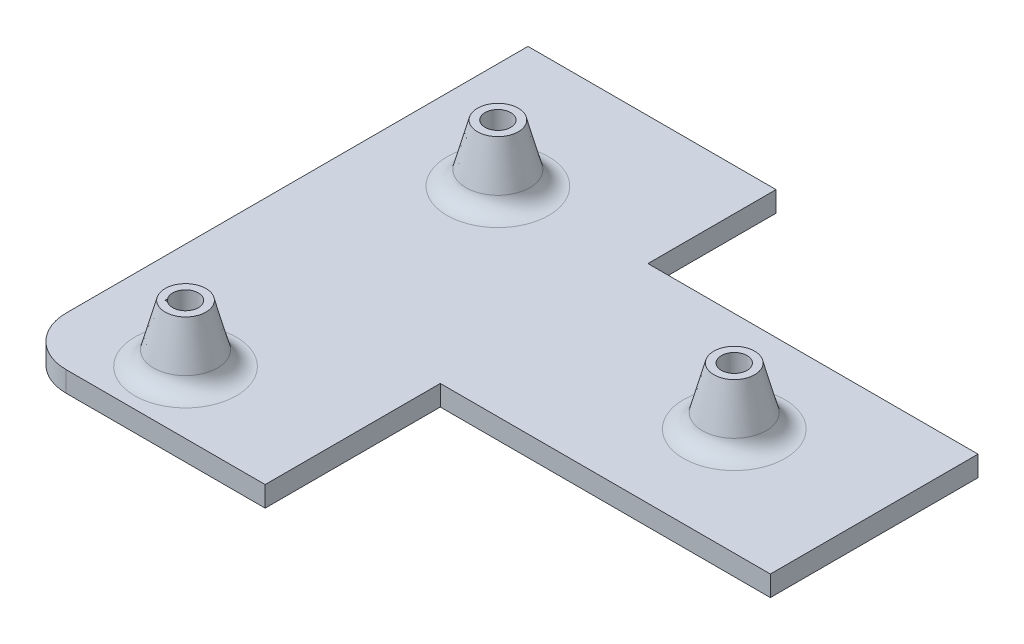
ISO-10303-21;
HEADER;
FILE_DESCRIPTION(('STEP AP214'),'2;1');
FILE_NAME('part.step','',(''),(''),'','','');
FILE_SCHEMA(('AUTOMOTIVE_DESIGN { 1 0 10303 214 1 1 1 1 }'));
ENDSEC;
DATA;
#1=APPLICATION_CONTEXT('core data for automotive mechanical design processes');
#2=APPLICATION_PROTOCOL_DEFINITION('international standard','automotive_design',2000,#1);
#3=PRODUCT_CONTEXT('',#1,'mechanical');
#4=PRODUCT('Part','Part','',(#3));
#5=PRODUCT_RELATED_PRODUCT_CATEGORY('part','',(#4));
#6=PRODUCT_DEFINITION_FORMATION('','',#4);
#7=PRODUCT_DEFINITION_CONTEXT('part definition',#1,'design');
#8=PRODUCT_DEFINITION('design','',#6,#7);
#9=PRODUCT_DEFINITION_SHAPE('','',#8);
#10=(LENGTH_UNIT() NAMED_UNIT(*) SI_UNIT(.MILLI.,.METRE.));
#11=(NAMED_UNIT(*) PLANE_ANGLE_UNIT() SI_UNIT($,.RADIAN.));
#12=(NAMED_UNIT(*) SI_UNIT($,.STERADIAN.) SOLID_ANGLE_UNIT());
#13=UNCERTAINTY_MEASURE_WITH_UNIT(LENGTH_MEASURE(1.E-05),#10,'distance_accuracy_value','');
#14=(GEOMETRIC_REPRESENTATION_CONTEXT(3) GLOBAL_UNCERTAINTY_ASSIGNED_CONTEXT((#13)) GLOBAL_UNIT_ASSIGNED_CONTEXT((#10,
#11,#12)) REPRESENTATION_CONTEXT('',''));
#15=CARTESIAN_POINT('',(0.,0.,0.));
#16=DIRECTION('',(0.,0.,1.));
#17=DIRECTION('',(1.,0.,0.));
#18=AXIS2_PLACEMENT_3D('',#15,#16,#17);
#19=CARTESIAN_POINT('',(0.,0.,0.));
#20=DIRECTION('',(0.,1.,0.));
#21=DIRECTION('',(0.,0.,1.));
#22=AXIS2_PLACEMENT_3D('',#19,#20,#21);
#23=PLANE('',#22);
#24=DIRECTION('',(0.,0.,1.));
#25=VECTOR('',#24,1.);
#26=CARTESIAN_POINT('',(-67.5556669820447,0.,0.));
#27=LINE('',#26,#25);
#28=CARTESIAN_POINT('',(-67.5556669820447,0.,85.856957909293));
#29=VERTEX_POINT('',#28);
#30=CARTESIAN_POINT('',(-67.5556669820447,0.,113.03));
#31=VERTEX_POINT('',#30);
#32=EDGE_CURVE('E170',#29,#31,#27,.T.);
#33=ORIENTED_EDGE('',*,*,#32,.F.);
#34=DIRECTION('',(-1.,0.,0.));
#35=VECTOR('',#34,1.);
#36=CARTESIAN_POINT('',(0.,0.,85.856957909293));
#37=LINE('',#36,#35);
#38=CARTESIAN_POINT('',(-16.3412905044358,0.,85.856957909293));
#39=VERTEX_POINT('',#38);
#40=EDGE_CURVE('E159',#39,#29,#37,.T.);
#41=ORIENTED_EDGE('',*,*,#40,.F.);
#42=DIRECTION('',(0.,0.,-1.));
#43=VECTOR('',#42,1.);
#44=CARTESIAN_POINT('',(-16.3412905044358,0.,0.));
#45=LINE('',#44,#43);
#46=CARTESIAN_POINT('',(-16.3412905044358,0.,53.6400333050258));
#47=VERTEX_POINT('',#46);
#48=EDGE_CURVE('E167',#39,#47,#45,.T.);
#49=ORIENTED_EDGE('',*,*,#48,.T.);
#50=DIRECTION('',(1.,0.,0.));
#51=VECTOR('',#50,1.);
#52=CARTESIAN_POINT('',(0.,0.,53.6400333050258));
#53=LINE('',#52,#51);
#54=CARTESIAN_POINT('',(-67.5556669820447,0.,53.6400333050258));
#55=VERTEX_POINT('',#54);
#56=EDGE_CURVE('E64',#55,#47,#53,.T.);
#57=ORIENTED_EDGE('',*,*,#56,.F.);
#58=DIRECTION('',(0.,0.,1.));
#59=VECTOR('',#58,1.);
#60=CARTESIAN_POINT('',(-67.5556669820447,0.,0.));
#61=LINE('',#60,#59);
#62=CARTESIAN_POINT('',(-67.5556669820447,0.,33.7617228346361));
#63=VERTEX_POINT('',#62);
#64=EDGE_CURVE('E153',#63,#55,#61,.T.);
#65=ORIENTED_EDGE('',*,*,#64,.F.);
#66=DIRECTION('',(-1.,0.,0.));
#67=VECTOR('',#66,1.);
#68=CARTESIAN_POINT('',(0.,0.,33.7617228346361));
#69=LINE('',#68,#67);
#70=CARTESIAN_POINT('',(-106.045,0.,33.7617228346361));
#71=VERTEX_POINT('',#70);
#72=EDGE_CURVE('E171',#63,#71,#69,.T.);
#73=ORIENTED_EDGE('',*,*,#72,.T.);
#74=DIRECTION('',(0.,0.,-1.));
#75=VECTOR('',#74,1.);
#76=CARTESIAN_POINT('',(-106.045,0.,0.));
#77=LINE('',#76,#75);
#78=CARTESIAN_POINT('',(-106.045,0.,105.41));
#79=VERTEX_POINT('',#78);
#80=EDGE_CURVE('E220',#79,#71,#77,.T.);
#81=ORIENTED_EDGE('',*,*,#80,.F.);
#82=CARTESIAN_POINT('',(-98.425,0.,105.41));
#83=DIRECTION('',(0.,1.,0.));
#84=DIRECTION('',(0.,0.,1.));
#85=AXIS2_PLACEMENT_3D('',#82,#83,#84);
#86=CIRCLE('',#85,7.62);
#87=CARTESIAN_POINT('',(-98.425,0.,113.03));
#88=VERTEX_POINT('',#87);
#89=EDGE_CURVE('E216',#79,#88,#86,.T.);
#90=ORIENTED_EDGE('',*,*,#89,.T.);
#91=DIRECTION('',(1.,0.,0.));
#92=VECTOR('',#91,1.);
#93=CARTESIAN_POINT('',(0.,0.,113.03));
#94=LINE('',#93,#92);
#95=EDGE_CURVE('E214',#88,#31,#94,.T.);
#96=ORIENTED_EDGE('',*,*,#95,.T.);
#97=EDGE_LOOP('',(#33,#41,#49,#57,#65,#73,#81,#90,#96));
#98=FACE_BOUND('',#97,.T.);
#99=CARTESIAN_POINT('',(-89.601054155575,0.,54.8757565004888));
#100=DIRECTION('',(0.,1.,0.));
#101=DIRECTION('',(0.,0.,1.));
#102=AXIS2_PLACEMENT_3D('',#99,#100,#101);
#103=CIRCLE('',#102,7.88871265935987);
#104=CARTESIAN_POINT('',(-89.601054155575,0.,62.7644691598487));
#105=VERTEX_POINT('',#104);
#106=EDGE_CURVE('E244',#105,#105,#103,.F.);
#107=ORIENTED_EDGE('',*,*,#106,.T.);
#108=EDGE_LOOP('',(#107));
#109=FACE_BOUND('',#108,.T.);
#110=CARTESIAN_POINT('',(-38.6136797552055,0.,69.1904177218448));
#111=DIRECTION('',(0.,1.,0.));
#112=DIRECTION('',(0.,0.,1.));
#113=AXIS2_PLACEMENT_3D('',#110,#111,#112);
#114=CIRCLE('',#113,7.88871265935986);
#115=CARTESIAN_POINT('',(-38.6136797552055,0.,77.0791303812047));
#116=VERTEX_POINT('',#115);
#117=EDGE_CURVE('E247',#116,#116,#114,.F.);
#118=ORIENTED_EDGE('',*,*,#117,.T.);
#119=EDGE_LOOP('',(#118));
#120=FACE_BOUND('',#119,.T.);
#121=CARTESIAN_POINT('',(-89.601054155575,0.,103.338956500489));
#122=DIRECTION('',(0.,1.,0.));
#123=DIRECTION('',(0.,0.,1.));
#124=AXIS2_PLACEMENT_3D('',#121,#122,#123);
#125=CIRCLE('',#124,7.88871265935987);
#126=CARTESIAN_POINT('',(-89.601054155575,0.,111.227669159849));
#127=VERTEX_POINT('',#126);
#128=EDGE_CURVE('E251',#127,#127,#125,.F.);
#129=ORIENTED_EDGE('',*,*,#128,.T.);
#130=EDGE_LOOP('',(#129));
#131=FACE_BOUND('',#130,.T.);
#132=ADVANCED_FACE('F48',(#98,#109,#120,#131),#23,.T.);
#133=CARTESIAN_POINT('',(0.,-3.175,113.03));
#134=DIRECTION('',(0.,0.,1.));
#135=DIRECTION('',(1.,0.,0.));
#136=AXIS2_PLACEMENT_3D('',#133,#134,#135);
#137=PLANE('',#136);
#138=DIRECTION('',(0.,-1.,0.));
#139=VECTOR('',#138,1.);
#140=CARTESIAN_POINT('',(-67.5556669820447,-3.175,113.03));
#141=LINE('',#140,#139);
#142=CARTESIAN_POINT('',(-67.5556669820447,-3.175,113.03));
#143=VERTEX_POINT('',#142);
#144=EDGE_CURVE('E162',#31,#143,#141,.T.);
#145=ORIENTED_EDGE('',*,*,#144,.F.);
#146=ORIENTED_EDGE('',*,*,#95,.F.);
#147=DIRECTION('',(0.,1.,0.));
#148=VECTOR('',#147,1.);
#149=CARTESIAN_POINT('',(-98.425,-3.175,113.03));
#150=LINE('',#149,#148);
#151=CARTESIAN_POINT('',(-98.425,-3.175,113.03));
#152=VERTEX_POINT('',#151);
#153=EDGE_CURVE('E228',#88,#152,#150,.F.);
#154=ORIENTED_EDGE('',*,*,#153,.T.);
#155=DIRECTION('',(1.,0.,0.));
#156=VECTOR('',#155,1.);
#157=CARTESIAN_POINT('',(0.,-3.175,113.03));
#158=LINE('',#157,#156);
#159=EDGE_CURVE('E215',#152,#143,#158,.T.);
#160=ORIENTED_EDGE('',*,*,#159,.T.);
#161=EDGE_LOOP('',(#145,#146,#154,#160));
#162=FACE_BOUND('',#161,.T.);
#163=ADVANCED_FACE('F285',(#162),#137,.T.);
#164=CARTESIAN_POINT('',(-106.045,-3.175,0.));
#165=DIRECTION('',(1.,0.,0.));
#166=DIRECTION('',(0.,0.,-1.));
#167=AXIS2_PLACEMENT_3D('',#164,#165,#166);
#168=PLANE('',#167);
#169=DIRECTION('',(0.,1.,0.));
#170=VECTOR('',#169,1.);
#171=CARTESIAN_POINT('',(-106.045,-3.175,33.7617228346361));
#172=LINE('',#171,#170);
#173=CARTESIAN_POINT('',(-106.045,-3.175,33.7617228346361));
#174=VERTEX_POINT('',#173);
#175=EDGE_CURVE('E174',#174,#71,#172,.T.);
#176=ORIENTED_EDGE('',*,*,#175,.F.);
#177=DIRECTION('',(0.,0.,-1.));
#178=VECTOR('',#177,1.);
#179=CARTESIAN_POINT('',(-106.045,-3.175,0.));
#180=LINE('',#179,#178);
#181=CARTESIAN_POINT('',(-106.045,-3.175,105.41));
#182=VERTEX_POINT('',#181);
#183=EDGE_CURVE('E208',#182,#174,#180,.T.);
#184=ORIENTED_EDGE('',*,*,#183,.F.);
#185=DIRECTION('',(0.,1.,0.));
#186=VECTOR('',#185,1.);
#187=CARTESIAN_POINT('',(-106.045,0.,105.41));
#188=LINE('',#187,#186);
#189=EDGE_CURVE('E221',#182,#79,#188,.T.);
#190=ORIENTED_EDGE('',*,*,#189,.T.);
#191=ORIENTED_EDGE('',*,*,#80,.T.);
#192=EDGE_LOOP('',(#176,#184,#190,#191));
#193=FACE_BOUND('',#192,.T.);
#194=ADVANCED_FACE('F274',(#193),#168,.F.);
#195=CARTESIAN_POINT('',(0.,-3.175,0.));
#196=DIRECTION('',(0.,1.,0.));
#197=DIRECTION('',(0.,0.,1.));
#198=AXIS2_PLACEMENT_3D('',#195,#196,#197);
#199=PLANE('',#198);
#200=DIRECTION('',(-1.,0.,0.));
#201=VECTOR('',#200,1.);
#202=CARTESIAN_POINT('',(0.,-3.175,85.856957909293));
#203=LINE('',#202,#201);
#204=CARTESIAN_POINT('',(-16.3412905044358,-3.175,85.856957909293));
#205=VERTEX_POINT('',#204);
#206=CARTESIAN_POINT('',(-67.5556669820447,-3.175,85.856957909293));
#207=VERTEX_POINT('',#206);
#208=EDGE_CURVE('E73',#205,#207,#203,.T.);
#209=ORIENTED_EDGE('',*,*,#208,.T.);
#210=DIRECTION('',(0.,0.,1.));
#211=VECTOR('',#210,1.);
#212=CARTESIAN_POINT('',(-67.5556669820447,-3.175,0.));
#213=LINE('',#212,#211);
#214=EDGE_CURVE('E12',#207,#143,#213,.T.);
#215=ORIENTED_EDGE('',*,*,#214,.T.);
#216=ORIENTED_EDGE('',*,*,#159,.F.);
#217=CARTESIAN_POINT('',(-98.425,-3.175,105.41));
#218=DIRECTION('',(0.,1.,0.));
#219=DIRECTION('',(0.,0.,1.));
#220=AXIS2_PLACEMENT_3D('',#217,#218,#219);
#221=CIRCLE('',#220,7.62);
#222=EDGE_CURVE('E222',#152,#182,#221,.F.);
#223=ORIENTED_EDGE('',*,*,#222,.T.);
#224=ORIENTED_EDGE('',*,*,#183,.T.);
#225=DIRECTION('',(-1.,0.,0.));
#226=VECTOR('',#225,1.);
#227=CARTESIAN_POINT('',(0.,-3.175,33.7617228346361));
#228=LINE('',#227,#226);
#229=CARTESIAN_POINT('',(-67.5556669820447,-3.175,33.7617228346361));
#230=VERTEX_POINT('',#229);
#231=EDGE_CURVE('E156',#230,#174,#228,.T.);
#232=ORIENTED_EDGE('',*,*,#231,.F.);
#233=DIRECTION('',(0.,0.,1.));
#234=VECTOR('',#233,1.);
#235=CARTESIAN_POINT('',(-67.5556669820447,-3.175,0.));
#236=LINE('',#235,#234);
#237=CARTESIAN_POINT('',(-67.5556669820447,-3.175,53.6400333050258));
#238=VERTEX_POINT('',#237);
#239=EDGE_CURVE('E146',#230,#238,#236,.T.);
#240=ORIENTED_EDGE('',*,*,#239,.T.);
#241=DIRECTION('',(1.,0.,0.));
#242=VECTOR('',#241,1.);
#243=CARTESIAN_POINT('',(0.,-3.175,53.6400333050258));
#244=LINE('',#243,#242);
#245=CARTESIAN_POINT('',(-16.3412905044358,-3.175,53.6400333050258));
#246=VERTEX_POINT('',#245);
#247=EDGE_CURVE('E140',#238,#246,#244,.T.);
#248=ORIENTED_EDGE('',*,*,#247,.T.);
#249=DIRECTION('',(0.,0.,-1.));
#250=VECTOR('',#249,1.);
#251=CARTESIAN_POINT('',(-16.3412905044358,-3.175,0.));
#252=LINE('',#251,#250);
#253=EDGE_CURVE('E259',#205,#246,#252,.T.);
#254=ORIENTED_EDGE('',*,*,#253,.F.);
#255=EDGE_LOOP('',(#209,#215,#216,#223,#224,#232,#240,#248,#254));
#256=FACE_BOUND('',#255,.T.);
#257=ADVANCED_FACE('F157',(#256),#199,.F.);
#258=CARTESIAN_POINT('',(-98.425,-3.175,105.41));
#259=DIRECTION('',(0.,-1.,0.));
#260=DIRECTION('',(0.,0.,-1.));
#261=AXIS2_PLACEMENT_3D('',#258,#259,#260);
#262=CYLINDRICAL_SURFACE('',#261,7.62);
#263=ORIENTED_EDGE('',*,*,#222,.F.);
#264=ORIENTED_EDGE('',*,*,#153,.F.);
#265=ORIENTED_EDGE('',*,*,#89,.F.);
#266=ORIENTED_EDGE('',*,*,#189,.F.);
#267=EDGE_LOOP('',(#263,#264,#265,#266));
#268=FACE_BOUND('',#267,.T.);
#269=ADVANCED_FACE('F283',(#268),#262,.T.);
#270=CARTESIAN_POINT('',(-91.188554155575,8.89,0.));
#271=DIRECTION('',(-1.,0.,0.));
#272=DIRECTION('',(0.,0.,1.));
#273=AXIS2_PLACEMENT_3D('',#270,#271,#272);
#274=PLANE('',#273);
#275=DIRECTION('',(0.,0.,-1.));
#276=VECTOR('',#275,1.);
#277=CARTESIAN_POINT('',(-91.188554155575,0.,0.));
#278=LINE('',#277,#276);
#279=CARTESIAN_POINT('',(-91.188554155575,0.,104.926456500489));
#280=VERTEX_POINT('',#279);
#281=CARTESIAN_POINT('',(-91.188554155575,0.,104.545389656532));
#282=VERTEX_POINT('',#281);
#283=EDGE_CURVE('E180',#280,#282,#278,.T.);
#284=ORIENTED_EDGE('',*,*,#283,.T.);
#285=DIRECTION('',(0.,-1.,0.));
#286=VECTOR('',#285,1.);
#287=CARTESIAN_POINT('',(-91.188554155575,8.89,104.545389656532));
#288=LINE('',#287,#286);
#289=CARTESIAN_POINT('',(-91.188554155575,8.89,104.545389656532));
#290=VERTEX_POINT('',#289);
#291=EDGE_CURVE('E188',#290,#282,#288,.T.);
#292=ORIENTED_EDGE('',*,*,#291,.F.);
#293=DIRECTION('',(0.,0.,-1.));
#294=VECTOR('',#293,1.);
#295=CARTESIAN_POINT('',(-91.188554155575,8.89,0.));
#296=LINE('',#295,#294);
#297=CARTESIAN_POINT('',(-91.188554155575,8.89,104.926456500489));
#298=VERTEX_POINT('',#297);
#299=EDGE_CURVE('E190',#298,#290,#296,.T.);
#300=ORIENTED_EDGE('',*,*,#299,.F.);
#301=DIRECTION('',(0.,-1.,0.));
#302=VECTOR('',#301,1.);
#303=CARTESIAN_POINT('',(-91.188554155575,8.89,104.926456500489));
#304=LINE('',#303,#302);
#305=EDGE_CURVE('E196',#298,#280,#304,.T.);
#306=ORIENTED_EDGE('',*,*,#305,.T.);
#307=EDGE_LOOP('',(#284,#292,#300,#306));
#308=FACE_BOUND('',#307,.T.);
#309=ADVANCED_FACE('F363',(#308),#274,.F.);
#310=CARTESIAN_POINT('',(-89.601054155575,8.89,103.338956500489));
#311=DIRECTION('',(0.,-1.,0.));
#312=DIRECTION('',(0.,0.,-1.));
#313=AXIS2_PLACEMENT_3D('',#310,#311,#312);
#314=CYLINDRICAL_SURFACE('',#313,1.9939);
#315=CARTESIAN_POINT('',(-89.601054155575,0.,103.338956500489));
#316=DIRECTION('',(0.,1.,0.));
#317=DIRECTION('',(0.,0.,1.));
#318=AXIS2_PLACEMENT_3D('',#315,#316,#317);
#319=CIRCLE('',#318,1.9939);
#320=CARTESIAN_POINT('',(-90.807487311618,0.,104.926456500489));
#321=VERTEX_POINT('',#320);
#322=EDGE_CURVE('E197',#321,#282,#319,.T.);
#323=ORIENTED_EDGE('',*,*,#322,.F.);
#324=DIRECTION('',(0.,-1.,0.));
#325=VECTOR('',#324,1.);
#326=CARTESIAN_POINT('',(-90.807487311618,8.89,104.926456500489));
#327=LINE('',#326,#325);
#328=CARTESIAN_POINT('',(-90.807487311618,8.89,104.926456500489));
#329=VERTEX_POINT('',#328);
#330=EDGE_CURVE('E204',#329,#321,#327,.T.);
#331=ORIENTED_EDGE('',*,*,#330,.F.);
#332=CARTESIAN_POINT('',(-89.601054155575,8.89,103.338956500489));
#333=DIRECTION('',(0.,1.,0.));
#334=DIRECTION('',(0.,0.,1.));
#335=AXIS2_PLACEMENT_3D('',#332,#333,#334);
#336=CIRCLE('',#335,1.9939);
#337=EDGE_CURVE('E189',#329,#290,#336,.T.);
#338=ORIENTED_EDGE('',*,*,#337,.T.);
#339=ORIENTED_EDGE('',*,*,#291,.T.);
#340=EDGE_LOOP('',(#323,#331,#338,#339));
#341=FACE_BOUND('',#340,.T.);
#342=ADVANCED_FACE('F365',(#341),#314,.F.);
#343=CARTESIAN_POINT('',(-89.601054155575,0.,103.338956500489));
#344=DIRECTION('',(0.,-1.,0.));
#345=DIRECTION('',(0.,0.,1.));
#346=AXIS2_PLACEMENT_3D('',#343,#344,#345);
#347=CONICAL_SURFACE('',#346,5.5499,0.26179938779915);
#348=CARTESIAN_POINT('',(-89.601054155575,2.25911955052752,103.338956500489));
#349=DIRECTION('',(0.,1.,0.));
#350=DIRECTION('',(0.,0.,1.));
#351=AXIS2_PLACEMENT_3D('',#348,#349,#350);
#352=CIRCLE('',#351,4.94457074083079);
#353=CARTESIAN_POINT('',(-89.601054155575,2.25911955052752,108.28352724132));
#354=VERTEX_POINT('',#353);
#355=EDGE_CURVE('E237',#354,#354,#352,.T.);
#356=ORIENTED_EDGE('',*,*,#355,.T.);
#357=EDGE_LOOP('',(#356));
#358=FACE_BOUND('',#357,.T.);
#359=CARTESIAN_POINT('',(-89.601054155575,8.89,103.338956500489));
#360=DIRECTION('',(0.,1.,0.));
#361=DIRECTION('',(0.,0.,1.));
#362=AXIS2_PLACEMENT_3D('',#359,#360,#361);
#363=CIRCLE('',#362,3.16783167928731);
#364=CARTESIAN_POINT('',(-89.601054155575,8.89,106.506788179776));
#365=VERTEX_POINT('',#364);
#366=EDGE_CURVE('E187',#365,#365,#363,.T.);
#367=ORIENTED_EDGE('',*,*,#366,.F.);
#368=EDGE_LOOP('',(#367));
#369=FACE_BOUND('',#368,.T.);
#370=ADVANCED_FACE('F358',(#358,#369),#347,.T.);
#371=CARTESIAN_POINT('',(0.,8.89,104.926456500489));
#372=DIRECTION('',(0.,0.,-1.));
#373=DIRECTION('',(-1.,0.,0.));
#374=AXIS2_PLACEMENT_3D('',#371,#372,#373);
#375=PLANE('',#374);
#376=DIRECTION('',(1.,0.,0.));
#377=VECTOR('',#376,1.);
#378=CARTESIAN_POINT('',(0.,0.,104.926456500489));
#379=LINE('',#378,#377);
#380=EDGE_CURVE('E201',#280,#321,#379,.T.);
#381=ORIENTED_EDGE('',*,*,#380,.F.);
#382=ORIENTED_EDGE('',*,*,#305,.F.);
#383=DIRECTION('',(1.,0.,0.));
#384=VECTOR('',#383,1.);
#385=CARTESIAN_POINT('',(0.,8.89,104.926456500489));
#386=LINE('',#385,#384);
#387=EDGE_CURVE('E193',#298,#329,#386,.T.);
#388=ORIENTED_EDGE('',*,*,#387,.T.);
#389=ORIENTED_EDGE('',*,*,#330,.T.);
#390=EDGE_LOOP('',(#381,#382,#388,#389));
#391=FACE_BOUND('',#390,.T.);
#392=ADVANCED_FACE('F332',(#391),#375,.T.);
#393=CARTESIAN_POINT('',(0.,8.89,0.));
#394=DIRECTION('',(0.,1.,0.));
#395=DIRECTION('',(0.,0.,1.));
#396=AXIS2_PLACEMENT_3D('',#393,#394,#395);
#397=PLANE('',#396);
#398=ORIENTED_EDGE('',*,*,#366,.T.);
#399=EDGE_LOOP('',(#398));
#400=FACE_BOUND('',#399,.T.);
#401=ORIENTED_EDGE('',*,*,#299,.T.);
#402=ORIENTED_EDGE('',*,*,#337,.F.);
#403=ORIENTED_EDGE('',*,*,#387,.F.);
#404=EDGE_LOOP('',(#401,#402,#403));
#405=FACE_BOUND('',#404,.T.);
#406=ADVANCED_FACE('F324',(#400,#405),#397,.T.);
#407=ORIENTED_EDGE('',*,*,#322,.T.);
#408=ORIENTED_EDGE('',*,*,#283,.F.);
#409=ORIENTED_EDGE('',*,*,#380,.T.);
#410=EDGE_LOOP('',(#407,#408,#409));
#411=FACE_BOUND('',#410,.T.);
#412=ADVANCED_FACE('F306',(#411),#23,.T.);
#413=CARTESIAN_POINT('',(-38.6136797552055,8.89,69.1904177218448));
#414=DIRECTION('',(0.,-1.,0.));
#415=DIRECTION('',(0.,0.,-1.));
#416=AXIS2_PLACEMENT_3D('',#413,#414,#415);
#417=CYLINDRICAL_SURFACE('',#416,1.9939);
#418=CARTESIAN_POINT('',(-38.6136797552055,8.89,69.1904177218448));
#419=DIRECTION('',(0.,1.,0.));
#420=DIRECTION('',(0.,0.,1.));
#421=AXIS2_PLACEMENT_3D('',#418,#419,#420);
#422=CIRCLE('',#421,1.9939);
#423=CARTESIAN_POINT('',(-38.6136797552055,8.89,71.1843177218448));
#424=VERTEX_POINT('',#423);
#425=EDGE_CURVE('E181',#424,#424,#422,.T.);
#426=ORIENTED_EDGE('',*,*,#425,.T.);
#427=EDGE_LOOP('',(#426));
#428=FACE_BOUND('',#427,.T.);
#429=CARTESIAN_POINT('',(-38.6136797552055,0.,69.1904177218448));
#430=DIRECTION('',(0.,1.,0.));
#431=DIRECTION('',(0.,0.,1.));
#432=AXIS2_PLACEMENT_3D('',#429,#430,#431);
#433=CIRCLE('',#432,1.9939);
#434=CARTESIAN_POINT('',(-38.6136797552055,0.,71.1843177218448));
#435=VERTEX_POINT('',#434);
#436=EDGE_CURVE('E229',#435,#435,#433,.F.);
#437=ORIENTED_EDGE('',*,*,#436,.T.);
#438=EDGE_LOOP('',(#437));
#439=FACE_BOUND('',#438,.T.);
#440=ADVANCED_FACE('F323',(#428,#439),#417,.F.);
#441=CARTESIAN_POINT('',(-38.6136797552055,0.,69.1904177218448));
#442=DIRECTION('',(0.,-1.,0.));
#443=DIRECTION('',(0.,0.,1.));
#444=AXIS2_PLACEMENT_3D('',#441,#442,#443);
#445=CONICAL_SURFACE('',#444,5.54989999999999,0.26179938779915);
#446=CARTESIAN_POINT('',(-38.6136797552055,2.25911955052752,69.1904177218448));
#447=DIRECTION('',(0.,1.,0.));
#448=DIRECTION('',(0.,0.,1.));
#449=AXIS2_PLACEMENT_3D('',#446,#447,#448);
#450=CIRCLE('',#449,4.94457074083078);
#451=CARTESIAN_POINT('',(-38.6136797552055,2.25911955052752,74.1349884626756));
#452=VERTEX_POINT('',#451);
#453=EDGE_CURVE('E252',#452,#452,#450,.T.);
#454=ORIENTED_EDGE('',*,*,#453,.T.);
#455=EDGE_LOOP('',(#454));
#456=FACE_BOUND('',#455,.T.);
#457=CARTESIAN_POINT('',(-38.6136797552055,8.89,69.1904177218448));
#458=DIRECTION('',(0.,1.,0.));
#459=DIRECTION('',(0.,0.,1.));
#460=AXIS2_PLACEMENT_3D('',#457,#458,#459);
#461=CIRCLE('',#460,3.16783167928731);
#462=CARTESIAN_POINT('',(-38.6136797552055,8.89,72.3582494011321));
#463=VERTEX_POINT('',#462);
#464=EDGE_CURVE('E182',#463,#463,#461,.T.);
#465=ORIENTED_EDGE('',*,*,#464,.F.);
#466=EDGE_LOOP('',(#465));
#467=FACE_BOUND('',#466,.T.);
#468=ADVANCED_FACE('F328',(#456,#467),#445,.T.);
#469=CARTESIAN_POINT('',(0.,8.89,0.));
#470=DIRECTION('',(0.,1.,0.));
#471=DIRECTION('',(0.,0.,1.));
#472=AXIS2_PLACEMENT_3D('',#469,#470,#471);
#473=PLANE('',#472);
#474=ORIENTED_EDGE('',*,*,#425,.F.);
#475=EDGE_LOOP('',(#474));
#476=FACE_BOUND('',#475,.T.);
#477=ORIENTED_EDGE('',*,*,#464,.T.);
#478=EDGE_LOOP('',(#477));
#479=FACE_BOUND('',#478,.T.);
#480=ADVANCED_FACE('F340',(#476,#479),#473,.T.);
#481=ORIENTED_EDGE('',*,*,#436,.F.);
#482=EDGE_LOOP('',(#481));
#483=FACE_BOUND('',#482,.T.);
#484=ADVANCED_FACE('F317',(#483),#23,.T.);
#485=CARTESIAN_POINT('',(-89.601054155575,8.89,54.8757565004888));
#486=DIRECTION('',(0.,-1.,0.));
#487=DIRECTION('',(0.,0.,-1.));
#488=AXIS2_PLACEMENT_3D('',#485,#486,#487);
#489=CYLINDRICAL_SURFACE('',#488,1.9939);
#490=CARTESIAN_POINT('',(-89.601054155575,8.89,54.8757565004888));
#491=DIRECTION('',(0.,1.,0.));
#492=DIRECTION('',(0.,0.,1.));
#493=AXIS2_PLACEMENT_3D('',#490,#491,#492);
#494=CIRCLE('',#493,1.9939);
#495=CARTESIAN_POINT('',(-89.601054155575,8.89,56.8696565004888));
#496=VERTEX_POINT('',#495);
#497=EDGE_CURVE('E178',#496,#496,#494,.T.);
#498=ORIENTED_EDGE('',*,*,#497,.T.);
#499=EDGE_LOOP('',(#498));
#500=FACE_BOUND('',#499,.T.);
#501=CARTESIAN_POINT('',(-89.601054155575,0.,54.8757565004888));
#502=DIRECTION('',(0.,1.,0.));
#503=DIRECTION('',(0.,0.,1.));
#504=AXIS2_PLACEMENT_3D('',#501,#502,#503);
#505=CIRCLE('',#504,1.9939);
#506=CARTESIAN_POINT('',(-89.601054155575,0.,56.8696565004888));
#507=VERTEX_POINT('',#506);
#508=EDGE_CURVE('E231',#507,#507,#505,.F.);
#509=ORIENTED_EDGE('',*,*,#508,.T.);
#510=EDGE_LOOP('',(#509));
#511=FACE_BOUND('',#510,.T.);
#512=ADVANCED_FACE('F338',(#500,#511),#489,.F.);
#513=CARTESIAN_POINT('',(-89.601054155575,0.,54.8757565004888));
#514=DIRECTION('',(0.,-1.,0.));
#515=DIRECTION('',(0.,0.,1.));
#516=AXIS2_PLACEMENT_3D('',#513,#514,#515);
#517=CONICAL_SURFACE('',#516,5.5499,0.26179938779915);
#518=CARTESIAN_POINT('',(-89.601054155575,2.25911955052751,54.8757565004888));
#519=DIRECTION('',(0.,1.,0.));
#520=DIRECTION('',(0.,0.,1.));
#521=AXIS2_PLACEMENT_3D('',#518,#519,#520);
#522=CIRCLE('',#521,4.94457074083079);
#523=CARTESIAN_POINT('',(-89.601054155575,2.25911955052751,59.8203272413196));
#524=VERTEX_POINT('',#523);
#525=EDGE_CURVE('E257',#524,#524,#522,.T.);
#526=ORIENTED_EDGE('',*,*,#525,.T.);
#527=EDGE_LOOP('',(#526));
#528=FACE_BOUND('',#527,.T.);
#529=CARTESIAN_POINT('',(-89.601054155575,8.89,54.8757565004888));
#530=DIRECTION('',(0.,1.,0.));
#531=DIRECTION('',(0.,0.,1.));
#532=AXIS2_PLACEMENT_3D('',#529,#530,#531);
#533=CIRCLE('',#532,3.16783167928732);
#534=CARTESIAN_POINT('',(-89.601054155575,8.89,58.0435881797761));
#535=VERTEX_POINT('',#534);
#536=EDGE_CURVE('E183',#535,#535,#533,.T.);
#537=ORIENTED_EDGE('',*,*,#536,.F.);
#538=EDGE_LOOP('',(#537));
#539=FACE_BOUND('',#538,.T.);
#540=ADVANCED_FACE('F345',(#528,#539),#517,.T.);
#541=CARTESIAN_POINT('',(0.,8.89,0.));
#542=DIRECTION('',(0.,1.,0.));
#543=DIRECTION('',(0.,0.,1.));
#544=AXIS2_PLACEMENT_3D('',#541,#542,#543);
#545=PLANE('',#544);
#546=ORIENTED_EDGE('',*,*,#497,.F.);
#547=EDGE_LOOP('',(#546));
#548=FACE_BOUND('',#547,.T.);
#549=ORIENTED_EDGE('',*,*,#536,.T.);
#550=EDGE_LOOP('',(#549));
#551=FACE_BOUND('',#550,.T.);
#552=ADVANCED_FACE('F320',(#548,#551),#545,.T.);
#553=ORIENTED_EDGE('',*,*,#508,.F.);
#554=EDGE_LOOP('',(#553));
#555=FACE_BOUND('',#554,.T.);
#556=ADVANCED_FACE('F310',(#555),#23,.T.);
#557=CARTESIAN_POINT('',(-89.601054155575,3.048,103.338956500489));
#558=DIRECTION('',(0.,1.,0.));
#559=DIRECTION('',(0.,0.,1.));
#560=AXIS2_PLACEMENT_3D('',#557,#558,#559);
#561=TOROIDAL_SURFACE('',#560,7.88871265935987,3.048);
#562=ORIENTED_EDGE('',*,*,#128,.F.);
#563=EDGE_LOOP('',(#562));
#564=FACE_BOUND('',#563,.T.);
#565=ORIENTED_EDGE('',*,*,#355,.F.);
#566=EDGE_LOOP('',(#565));
#567=FACE_BOUND('',#566,.T.);
#568=ADVANCED_FACE('F316',(#564,#567),#561,.F.);
#569=CARTESIAN_POINT('',(-38.6136797552055,3.048,69.1904177218448));
#570=DIRECTION('',(0.,1.,0.));
#571=DIRECTION('',(0.,0.,1.));
#572=AXIS2_PLACEMENT_3D('',#569,#570,#571);
#573=TOROIDAL_SURFACE('',#572,7.88871265935986,3.048);
#574=ORIENTED_EDGE('',*,*,#117,.F.);
#575=EDGE_LOOP('',(#574));
#576=FACE_BOUND('',#575,.T.);
#577=ORIENTED_EDGE('',*,*,#453,.F.);
#578=EDGE_LOOP('',(#577));
#579=FACE_BOUND('',#578,.T.);
#580=ADVANCED_FACE('F387',(#576,#579),#573,.F.);
#581=CARTESIAN_POINT('',(-89.601054155575,3.048,54.8757565004888));
#582=DIRECTION('',(0.,1.,0.));
#583=DIRECTION('',(0.,0.,1.));
#584=AXIS2_PLACEMENT_3D('',#581,#582,#583);
#585=TOROIDAL_SURFACE('',#584,7.88871265935987,3.048);
#586=ORIENTED_EDGE('',*,*,#106,.F.);
#587=EDGE_LOOP('',(#586));
#588=FACE_BOUND('',#587,.T.);
#589=ORIENTED_EDGE('',*,*,#525,.F.);
#590=EDGE_LOOP('',(#589));
#591=FACE_BOUND('',#590,.T.);
#592=ADVANCED_FACE('F49',(#588,#591),#585,.F.);
#593=CARTESIAN_POINT('',(-116.238990946647,-9.525,33.7617228346361));
#594=DIRECTION('',(0.,0.,-1.));
#595=DIRECTION('',(-1.,0.,0.));
#596=AXIS2_PLACEMENT_3D('',#593,#594,#595);
#597=PLANE('',#596);
#598=DIRECTION('',(0.,1.,0.));
#599=VECTOR('',#598,1.);
#600=CARTESIAN_POINT('',(-67.5556669820447,-9.525,33.7617228346361));
#601=LINE('',#600,#599);
#602=EDGE_CURVE('E57',#230,#63,#601,.T.);
#603=ORIENTED_EDGE('',*,*,#602,.F.);
#604=ORIENTED_EDGE('',*,*,#231,.T.);
#605=ORIENTED_EDGE('',*,*,#175,.T.);
#606=ORIENTED_EDGE('',*,*,#72,.F.);
#607=EDGE_LOOP('',(#603,#604,#605,#606));
#608=FACE_BOUND('',#607,.T.);
#609=ADVANCED_FACE('F271',(#608),#597,.T.);
#610=CARTESIAN_POINT('',(-16.3412905044358,-9.525,33.7617228346361));
#611=DIRECTION('',(1.,0.,0.));
#612=DIRECTION('',(0.,0.,-1.));
#613=AXIS2_PLACEMENT_3D('',#610,#611,#612);
#614=PLANE('',#613);
#615=DIRECTION('',(0.,1.,0.));
#616=VECTOR('',#615,1.);
#617=CARTESIAN_POINT('',(-16.3412905044358,-9.525,85.856957909293));
#618=LINE('',#617,#616);
#619=EDGE_CURVE('E264',#205,#39,#618,.T.);
#620=ORIENTED_EDGE('',*,*,#619,.F.);
#621=ORIENTED_EDGE('',*,*,#253,.T.);
#622=DIRECTION('',(0.,-1.,0.));
#623=VECTOR('',#622,1.);
#624=CARTESIAN_POINT('',(-16.3412905044358,-9.525,53.6400333050258));
#625=LINE('',#624,#623);
#626=EDGE_CURVE('E141',#47,#246,#625,.T.);
#627=ORIENTED_EDGE('',*,*,#626,.F.);
#628=ORIENTED_EDGE('',*,*,#48,.F.);
#629=EDGE_LOOP('',(#620,#621,#627,#628));
#630=FACE_BOUND('',#629,.T.);
#631=ADVANCED_FACE('F294',(#630),#614,.T.);
#632=CARTESIAN_POINT('',(-67.5556669820447,-9.525,15.1368795096821));
#633=DIRECTION('',(-1.,0.,0.));
#634=DIRECTION('',(0.,0.,1.));
#635=AXIS2_PLACEMENT_3D('',#632,#633,#634);
#636=PLANE('',#635);
#637=ORIENTED_EDGE('',*,*,#64,.T.);
#638=DIRECTION('',(0.,1.,0.));
#639=VECTOR('',#638,1.);
#640=CARTESIAN_POINT('',(-67.5556669820447,-9.525,53.6400333050258));
#641=LINE('',#640,#639);
#642=EDGE_CURVE('E138',#238,#55,#641,.T.);
#643=ORIENTED_EDGE('',*,*,#642,.F.);
#644=ORIENTED_EDGE('',*,*,#239,.F.);
#645=ORIENTED_EDGE('',*,*,#602,.T.);
#646=EDGE_LOOP('',(#637,#643,#644,#645));
#647=FACE_BOUND('',#646,.T.);
#648=ADVANCED_FACE('F150',(#647),#636,.F.);
#649=CARTESIAN_POINT('',(-67.5556669820447,-9.525,53.6400333050258));
#650=DIRECTION('',(0.,0.,1.));
#651=DIRECTION('',(1.,0.,0.));
#652=AXIS2_PLACEMENT_3D('',#649,#650,#651);
#653=PLANE('',#652);
#654=ORIENTED_EDGE('',*,*,#56,.T.);
#655=ORIENTED_EDGE('',*,*,#626,.T.);
#656=ORIENTED_EDGE('',*,*,#247,.F.);
#657=ORIENTED_EDGE('',*,*,#642,.T.);
#658=EDGE_LOOP('',(#654,#655,#656,#657));
#659=FACE_BOUND('',#658,.T.);
#660=ADVANCED_FACE('F136',(#659),#653,.F.);
#661=CARTESIAN_POINT('',(-67.5556669820447,-9.525,119.448995149108));
#662=DIRECTION('',(-1.,0.,0.));
#663=DIRECTION('',(0.,0.,1.));
#664=AXIS2_PLACEMENT_3D('',#661,#662,#663);
#665=PLANE('',#664);
#666=ORIENTED_EDGE('',*,*,#32,.T.);
#667=ORIENTED_EDGE('',*,*,#144,.T.);
#668=ORIENTED_EDGE('',*,*,#214,.F.);
#669=DIRECTION('',(0.,1.,0.));
#670=VECTOR('',#669,1.);
#671=CARTESIAN_POINT('',(-67.5556669820447,-9.525,85.856957909293));
#672=LINE('',#671,#670);
#673=EDGE_CURVE('E148',#207,#29,#672,.T.);
#674=ORIENTED_EDGE('',*,*,#673,.T.);
#675=EDGE_LOOP('',(#666,#667,#668,#674));
#676=FACE_BOUND('',#675,.T.);
#677=ADVANCED_FACE('F289',(#676),#665,.F.);
#678=CARTESIAN_POINT('',(-6.06848770682752,-9.525,85.856957909293));
#679=DIRECTION('',(0.,0.,-1.));
#680=DIRECTION('',(-1.,0.,0.));
#681=AXIS2_PLACEMENT_3D('',#678,#679,#680);
#682=PLANE('',#681);
#683=ORIENTED_EDGE('',*,*,#40,.T.);
#684=ORIENTED_EDGE('',*,*,#673,.F.);
#685=ORIENTED_EDGE('',*,*,#208,.F.);
#686=ORIENTED_EDGE('',*,*,#619,.T.);
#687=EDGE_LOOP('',(#683,#684,#685,#686));
#688=FACE_BOUND('',#687,.T.);
#689=ADVANCED_FACE('F286',(#688),#682,.F.);
#690=CLOSED_SHELL('',(#132,#163,#194,#257,#269,#309,#342,#370,#392,#406,#412,#440,#468,#480,
#484,#512,#540,#552,#556,#568,#580,#592,#609,#631,#648,#660,#677,#689));
#691=MANIFOLD_SOLID_BREP('B2',#690);
#692=ADVANCED_BREP_SHAPE_REPRESENTATION('',(#18,#691),#14);
#693=SHAPE_DEFINITION_REPRESENTATION(#9,#692);
ENDSEC;
END-ISO-10303-21;
